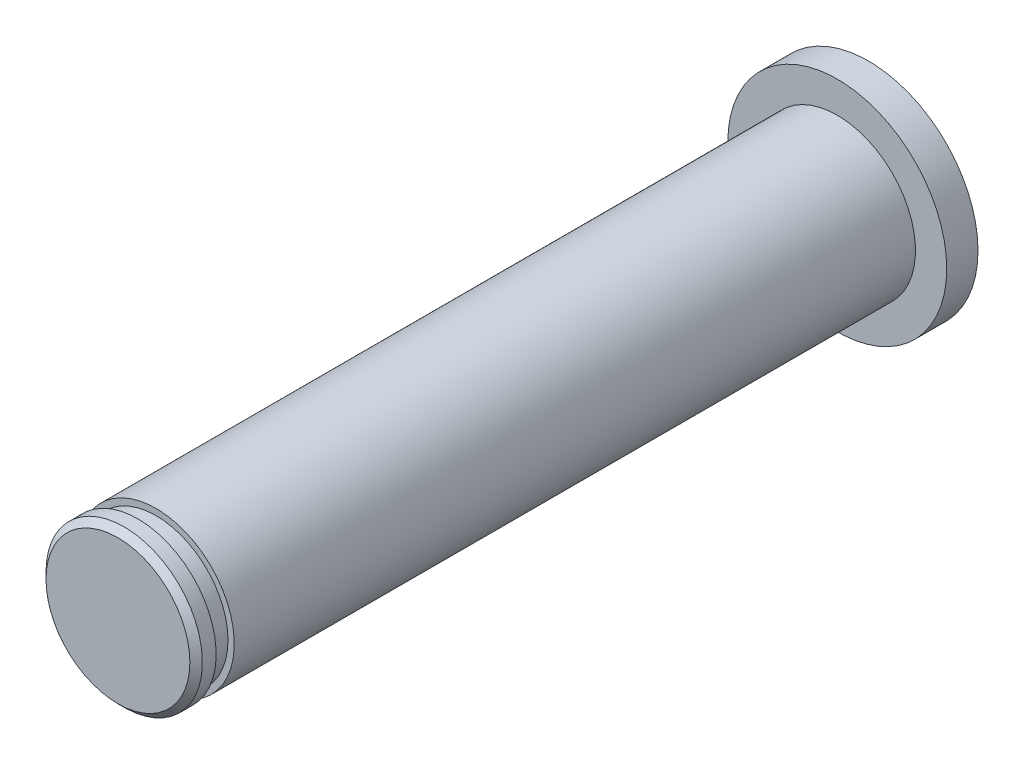
ISO-10303-21;
HEADER;
FILE_DESCRIPTION(('STEP AP214'),'2;1');
FILE_NAME('part.step','',(''),(''),'','','');
FILE_SCHEMA(('AUTOMOTIVE_DESIGN { 1 0 10303 214 1 1 1 1 }'));
ENDSEC;
DATA;
#1=APPLICATION_CONTEXT('core data for automotive mechanical design processes');
#2=APPLICATION_PROTOCOL_DEFINITION('international standard','automotive_design',2000,#1);
#3=PRODUCT_CONTEXT('',#1,'mechanical');
#4=PRODUCT('Part','Part','',(#3));
#5=PRODUCT_RELATED_PRODUCT_CATEGORY('part','',(#4));
#6=PRODUCT_DEFINITION_FORMATION('','',#4);
#7=PRODUCT_DEFINITION_CONTEXT('part definition',#1,'design');
#8=PRODUCT_DEFINITION('design','',#6,#7);
#9=PRODUCT_DEFINITION_SHAPE('','',#8);
#10=(LENGTH_UNIT() NAMED_UNIT(*) SI_UNIT(.MILLI.,.METRE.));
#11=(NAMED_UNIT(*) PLANE_ANGLE_UNIT() SI_UNIT($,.RADIAN.));
#12=(NAMED_UNIT(*) SI_UNIT($,.STERADIAN.) SOLID_ANGLE_UNIT());
#13=UNCERTAINTY_MEASURE_WITH_UNIT(LENGTH_MEASURE(1.E-05),#10,'distance_accuracy_value','');
#14=(GEOMETRIC_REPRESENTATION_CONTEXT(3) GLOBAL_UNCERTAINTY_ASSIGNED_CONTEXT((#13)) GLOBAL_UNIT_ASSIGNED_CONTEXT((#10,
#11,#12)) REPRESENTATION_CONTEXT('',''));
#15=CARTESIAN_POINT('',(0.,0.,0.));
#16=DIRECTION('',(0.,0.,1.));
#17=DIRECTION('',(1.,0.,0.));
#18=AXIS2_PLACEMENT_3D('',#15,#16,#17);
#19=CARTESIAN_POINT('',(0.,0.,30.48));
#20=DIRECTION('',(0.,0.,-1.));
#21=DIRECTION('',(-1.,0.,0.));
#22=AXIS2_PLACEMENT_3D('',#19,#20,#21);
#23=CYLINDRICAL_SURFACE('',#22,3.175);
#24=CARTESIAN_POINT('',(0.,0.,1.27));
#25=DIRECTION('',(0.,0.,1.));
#26=DIRECTION('',(1.,0.,0.));
#27=AXIS2_PLACEMENT_3D('',#24,#25,#26);
#28=CIRCLE('',#27,3.175);
#29=CARTESIAN_POINT('',(-3.175,0.,1.27));
#30=VERTEX_POINT('',#29);
#31=EDGE_CURVE('E45',#30,#30,#28,.T.);
#32=CARTESIAN_POINT('',(0.,0.,28.9306));
#33=DIRECTION('',(0.,0.,1.));
#34=DIRECTION('',(1.,0.,0.));
#35=AXIS2_PLACEMENT_3D('',#32,#33,#34);
#36=CIRCLE('',#35,3.175);
#37=CARTESIAN_POINT('',(-3.175,0.,28.9306));
#38=VERTEX_POINT('',#37);
#39=EDGE_CURVE('E55',#38,#38,#36,.T.);
#40=CARTESIAN_POINT('',(-3.175,0.,1.27));
#41=CARTESIAN_POINT('',(-3.175,0.,1.55813125));
#42=CARTESIAN_POINT('',(-3.175,0.,1.8462625));
#43=CARTESIAN_POINT('',(-3.175,0.,2.422525));
#44=CARTESIAN_POINT('',(-3.175,0.,2.71065625));
#45=CARTESIAN_POINT('',(-3.175,0.,3.28691875));
#46=CARTESIAN_POINT('',(-3.175,0.,3.57505));
#47=CARTESIAN_POINT('',(-3.175,0.,4.1513125));
#48=CARTESIAN_POINT('',(-3.175,0.,4.43944375));
#49=CARTESIAN_POINT('',(-3.175,0.,5.01570625));
#50=CARTESIAN_POINT('',(-3.175,0.,5.3038375));
#51=CARTESIAN_POINT('',(-3.175,0.,5.8801));
#52=CARTESIAN_POINT('',(-3.175,0.,6.16823125));
#53=CARTESIAN_POINT('',(-3.175,0.,6.74449375));
#54=CARTESIAN_POINT('',(-3.175,0.,7.032625));
#55=CARTESIAN_POINT('',(-3.175,0.,7.6088875));
#56=CARTESIAN_POINT('',(-3.175,0.,7.89701875));
#57=CARTESIAN_POINT('',(-3.175,0.,8.47328125));
#58=CARTESIAN_POINT('',(-3.175,0.,8.7614125));
#59=CARTESIAN_POINT('',(-3.175,0.,9.337675));
#60=CARTESIAN_POINT('',(-3.175,0.,9.62580625));
#61=CARTESIAN_POINT('',(-3.175,0.,10.20206875));
#62=CARTESIAN_POINT('',(-3.175,0.,10.4902));
#63=CARTESIAN_POINT('',(-3.175,0.,11.0664625));
#64=CARTESIAN_POINT('',(-3.175,0.,11.35459375));
#65=CARTESIAN_POINT('',(-3.175,0.,11.93085625));
#66=CARTESIAN_POINT('',(-3.175,0.,12.2189875));
#67=CARTESIAN_POINT('',(-3.175,0.,12.79525));
#68=CARTESIAN_POINT('',(-3.175,0.,13.08338125));
#69=CARTESIAN_POINT('',(-3.175,0.,13.65964375));
#70=CARTESIAN_POINT('',(-3.175,0.,13.947775));
#71=CARTESIAN_POINT('',(-3.175,0.,14.5240375));
#72=CARTESIAN_POINT('',(-3.175,0.,14.81216875));
#73=CARTESIAN_POINT('',(-3.175,0.,15.38843125));
#74=CARTESIAN_POINT('',(-3.175,0.,15.6765625));
#75=CARTESIAN_POINT('',(-3.175,0.,16.252825));
#76=CARTESIAN_POINT('',(-3.175,0.,16.54095625));
#77=CARTESIAN_POINT('',(-3.175,0.,17.11721875));
#78=CARTESIAN_POINT('',(-3.175,0.,17.40535));
#79=CARTESIAN_POINT('',(-3.175,0.,17.9816125));
#80=CARTESIAN_POINT('',(-3.175,0.,18.26974375));
#81=CARTESIAN_POINT('',(-3.175,0.,18.84600625));
#82=CARTESIAN_POINT('',(-3.175,0.,19.1341375));
#83=CARTESIAN_POINT('',(-3.175,0.,19.7104));
#84=CARTESIAN_POINT('',(-3.175,0.,19.99853125));
#85=CARTESIAN_POINT('',(-3.175,0.,20.57479375));
#86=CARTESIAN_POINT('',(-3.175,0.,20.862925));
#87=CARTESIAN_POINT('',(-3.175,0.,21.4391875));
#88=CARTESIAN_POINT('',(-3.175,0.,21.72731875));
#89=CARTESIAN_POINT('',(-3.175,0.,22.30358125));
#90=CARTESIAN_POINT('',(-3.175,0.,22.5917125));
#91=CARTESIAN_POINT('',(-3.175,0.,23.167975));
#92=CARTESIAN_POINT('',(-3.175,0.,23.45610625));
#93=CARTESIAN_POINT('',(-3.175,0.,24.03236875));
#94=CARTESIAN_POINT('',(-3.175,0.,24.3205));
#95=CARTESIAN_POINT('',(-3.175,0.,24.8967625));
#96=CARTESIAN_POINT('',(-3.175,0.,25.18489375));
#97=CARTESIAN_POINT('',(-3.175,0.,25.76115625));
#98=CARTESIAN_POINT('',(-3.175,0.,26.0492875));
#99=CARTESIAN_POINT('',(-3.175,0.,26.62555));
#100=CARTESIAN_POINT('',(-3.175,0.,26.91368125));
#101=CARTESIAN_POINT('',(-3.175,0.,27.48994375));
#102=CARTESIAN_POINT('',(-3.175,0.,27.778075));
#103=CARTESIAN_POINT('',(-3.175,0.,28.3543375));
#104=CARTESIAN_POINT('',(-3.175,0.,28.64246875));
#105=CARTESIAN_POINT('',(-3.175,0.,28.9306));
#106=B_SPLINE_CURVE_WITH_KNOTS('',3,(#40,#41,#42,#43,#44,#45,#46,#47,#48,#49,#50,#51,#52,#53,
#54,#55,#56,#57,#58,#59,#60,#61,#62,#63,#64,#65,#66,#67,#68,#69,#70,#71,#72,#73,#74,#75,#76,#77,
#78,#79,#80,#81,#82,#83,#84,#85,#86,#87,#88,#89,#90,#91,#92,#93,#94,#95,#96,#97,#98,#99,#100,
#101,#102,#103,#104,#105),.UNSPECIFIED.,.F.,.F.,(4,2,2,2,2,2,2,2,2,2,2,2,2,2,2,2,2,2,2,2,2,2,2,
2,2,2,2,2,2,2,2,2,4),(0.,0.864393750000001,1.7287875,2.59318125,3.457575,4.32196875,5.1863625,
6.05075625,6.91515,7.77954375,8.6439375,9.50833125,10.372725,11.23711875,12.1015125,12.96590625,
13.8303,14.69469375,15.5590875,16.42348125,17.287875,18.15226875,19.0166625,19.88105625,
20.74545,21.60984375,22.4742375,23.33863125,24.203025,25.06741875,25.9318125,26.79620625,
27.6606),.UNSPECIFIED.);
#107=EDGE_CURVE('BSEAM33',#30,#38,#106,.T.);
#108=ORIENTED_EDGE('',*,*,#31,.T.);
#109=ORIENTED_EDGE('',*,*,#39,.F.);
#110=ORIENTED_EDGE('',*,*,#107,.T.);
#111=ORIENTED_EDGE('',*,*,#107,.F.);
#112=EDGE_LOOP('',(#108,#110,#109,#111));
#113=FACE_BOUND('',#112,.T.);
#114=ADVANCED_FACE('F33',(#113),#23,.T.);
#115=CARTESIAN_POINT('',(0.,0.,1.27));
#116=DIRECTION('',(0.,0.,-1.));
#117=DIRECTION('',(-1.,0.,0.));
#118=AXIS2_PLACEMENT_3D('',#115,#116,#117);
#119=CYLINDRICAL_SURFACE('',#118,4.445);
#120=CARTESIAN_POINT('',(0.,0.,1.27));
#121=DIRECTION('',(0.,0.,1.));
#122=DIRECTION('',(1.,0.,0.));
#123=AXIS2_PLACEMENT_3D('',#120,#121,#122);
#124=CIRCLE('',#123,4.445);
#125=CARTESIAN_POINT('',(4.445,0.,1.27));
#126=VERTEX_POINT('',#125);
#127=EDGE_CURVE('E49',#126,#126,#124,.T.);
#128=ORIENTED_EDGE('',*,*,#127,.F.);
#129=EDGE_LOOP('',(#128));
#130=FACE_BOUND('',#129,.T.);
#131=CARTESIAN_POINT('',(0.,0.,0.));
#132=DIRECTION('',(0.,0.,1.));
#133=DIRECTION('',(1.,0.,0.));
#134=AXIS2_PLACEMENT_3D('',#131,#132,#133);
#135=CIRCLE('',#134,4.445);
#136=CARTESIAN_POINT('',(4.445,0.,0.));
#137=VERTEX_POINT('',#136);
#138=EDGE_CURVE('E52',#137,#137,#135,.T.);
#139=ORIENTED_EDGE('',*,*,#138,.T.);
#140=EDGE_LOOP('',(#139));
#141=FACE_BOUND('',#140,.T.);
#142=ADVANCED_FACE('F82',(#130,#141),#119,.T.);
#143=CARTESIAN_POINT('',(0.,0.,1.27));
#144=DIRECTION('',(0.,0.,1.));
#145=DIRECTION('',(1.,0.,0.));
#146=AXIS2_PLACEMENT_3D('',#143,#144,#145);
#147=PLANE('',#146);
#148=ORIENTED_EDGE('',*,*,#31,.F.);
#149=EDGE_LOOP('',(#148));
#150=FACE_BOUND('',#149,.T.);
#151=ORIENTED_EDGE('',*,*,#127,.T.);
#152=EDGE_LOOP('',(#151));
#153=FACE_BOUND('',#152,.T.);
#154=ADVANCED_FACE('F89',(#150,#153),#147,.T.);
#155=CARTESIAN_POINT('',(0.,0.,0.));
#156=DIRECTION('',(0.,0.,1.));
#157=DIRECTION('',(1.,0.,0.));
#158=AXIS2_PLACEMENT_3D('',#155,#156,#157);
#159=PLANE('',#158);
#160=ORIENTED_EDGE('',*,*,#138,.F.);
#161=EDGE_LOOP('',(#160));
#162=FACE_BOUND('',#161,.T.);
#163=ADVANCED_FACE('F77',(#162),#159,.F.);
#164=CARTESIAN_POINT('',(0.,0.,28.9306));
#165=DIRECTION('',(0.,0.,1.));
#166=DIRECTION('',(1.,0.,0.));
#167=AXIS2_PLACEMENT_3D('',#164,#165,#166);
#168=PLANE('',#167);
#169=CARTESIAN_POINT('',(0.,0.,28.9306));
#170=DIRECTION('',(0.,0.,1.));
#171=DIRECTION('',(1.,0.,0.));
#172=AXIS2_PLACEMENT_3D('',#169,#170,#171);
#173=CIRCLE('',#172,2.921);
#174=CARTESIAN_POINT('',(2.921,0.,28.9306));
#175=VERTEX_POINT('',#174);
#176=EDGE_CURVE('E61',#175,#175,#173,.T.);
#177=ORIENTED_EDGE('',*,*,#176,.F.);
#178=EDGE_LOOP('',(#177));
#179=FACE_BOUND('',#178,.T.);
#180=ORIENTED_EDGE('',*,*,#39,.T.);
#181=EDGE_LOOP('',(#180));
#182=FACE_BOUND('',#181,.T.);
#183=ADVANCED_FACE('F73',(#179,#182),#168,.T.);
#184=CARTESIAN_POINT('',(0.,0.,29.6672));
#185=DIRECTION('',(0.,0.,1.));
#186=DIRECTION('',(1.,0.,0.));
#187=AXIS2_PLACEMENT_3D('',#184,#185,#186);
#188=PLANE('',#187);
#189=CARTESIAN_POINT('',(0.,0.,29.6672));
#190=DIRECTION('',(0.,0.,1.));
#191=DIRECTION('',(1.,0.,0.));
#192=AXIS2_PLACEMENT_3D('',#189,#190,#191);
#193=CIRCLE('',#192,2.921);
#194=CARTESIAN_POINT('',(2.921,0.,29.6672));
#195=VERTEX_POINT('',#194);
#196=EDGE_CURVE('E64',#195,#195,#193,.T.);
#197=ORIENTED_EDGE('',*,*,#196,.T.);
#198=EDGE_LOOP('',(#197));
#199=FACE_BOUND('',#198,.T.);
#200=CARTESIAN_POINT('',(0.,0.,29.6672));
#201=DIRECTION('',(0.,0.,1.));
#202=DIRECTION('',(1.,0.,0.));
#203=AXIS2_PLACEMENT_3D('',#200,#201,#202);
#204=CIRCLE('',#203,3.175);
#205=CARTESIAN_POINT('',(-3.175,0.,29.6672));
#206=VERTEX_POINT('',#205);
#207=EDGE_CURVE('E58',#206,#206,#204,.T.);
#208=ORIENTED_EDGE('',*,*,#207,.F.);
#209=EDGE_LOOP('',(#208));
#210=FACE_BOUND('',#209,.T.);
#211=ADVANCED_FACE('F76',(#199,#210),#188,.F.);
#212=CARTESIAN_POINT('',(0.,0.,28.9306));
#213=DIRECTION('',(0.,0.,1.));
#214=DIRECTION('',(1.,0.,0.));
#215=AXIS2_PLACEMENT_3D('',#212,#213,#214);
#216=CYLINDRICAL_SURFACE('',#215,2.921);
#217=ORIENTED_EDGE('',*,*,#176,.T.);
#218=EDGE_LOOP('',(#217));
#219=FACE_BOUND('',#218,.T.);
#220=ORIENTED_EDGE('',*,*,#196,.F.);
#221=EDGE_LOOP('',(#220));
#222=FACE_BOUND('',#221,.T.);
#223=ADVANCED_FACE('F70',(#219,#222),#216,.T.);
#224=CARTESIAN_POINT('',(0.,0.,30.48));
#225=DIRECTION('',(0.,0.,1.));
#226=DIRECTION('',(1.,0.,0.));
#227=AXIS2_PLACEMENT_3D('',#224,#225,#226);
#228=PLANE('',#227);
#229=CARTESIAN_POINT('',(0.,0.,30.48));
#230=DIRECTION('',(0.,0.,1.));
#231=DIRECTION('',(1.,0.,0.));
#232=AXIS2_PLACEMENT_3D('',#229,#230,#231);
#233=CIRCLE('',#232,2.92100000000001);
#234=CARTESIAN_POINT('',(2.92100000000001,0.,30.48));
#235=VERTEX_POINT('',#234);
#236=EDGE_CURVE('E41',#235,#235,#233,.T.);
#237=ORIENTED_EDGE('',*,*,#236,.T.);
#238=EDGE_LOOP('',(#237));
#239=FACE_BOUND('',#238,.T.);
#240=ADVANCED_FACE('F94',(#239),#228,.T.);
#241=CARTESIAN_POINT('',(0.,0.,30.226));
#242=DIRECTION('',(0.,0.,1.));
#243=DIRECTION('',(1.,0.,0.));
#244=AXIS2_PLACEMENT_3D('',#241,#242,#243);
#245=CIRCLE('',#244,3.175);
#246=CARTESIAN_POINT('',(-3.175,0.,30.226));
#247=VERTEX_POINT('',#246);
#248=EDGE_CURVE('E10',#247,#247,#245,.F.);
#249=CARTESIAN_POINT('',(-3.175,0.,30.226));
#250=CARTESIAN_POINT('',(-3.175,0.,30.2201791666667));
#251=CARTESIAN_POINT('',(-3.175,0.,30.2143583333333));
#252=CARTESIAN_POINT('',(-3.175,0.,30.2027166666667));
#253=CARTESIAN_POINT('',(-3.175,0.,30.1968958333333));
#254=CARTESIAN_POINT('',(-3.175,0.,30.1852541666667));
#255=CARTESIAN_POINT('',(-3.175,0.,30.1794333333333));
#256=CARTESIAN_POINT('',(-3.175,0.,30.1677916666667));
#257=CARTESIAN_POINT('',(-3.175,0.,30.1619708333333));
#258=CARTESIAN_POINT('',(-3.175,0.,30.1503291666667));
#259=CARTESIAN_POINT('',(-3.175,0.,30.1445083333333));
#260=CARTESIAN_POINT('',(-3.175,0.,30.1328666666667));
#261=CARTESIAN_POINT('',(-3.175,0.,30.1270458333333));
#262=CARTESIAN_POINT('',(-3.175,0.,30.1154041666667));
#263=CARTESIAN_POINT('',(-3.175,0.,30.1095833333333));
#264=CARTESIAN_POINT('',(-3.175,0.,30.0979416666667));
#265=CARTESIAN_POINT('',(-3.175,0.,30.0921208333333));
#266=CARTESIAN_POINT('',(-3.175,0.,30.0804791666667));
#267=CARTESIAN_POINT('',(-3.175,0.,30.0746583333333));
#268=CARTESIAN_POINT('',(-3.175,0.,30.0630166666667));
#269=CARTESIAN_POINT('',(-3.175,0.,30.0571958333333));
#270=CARTESIAN_POINT('',(-3.175,0.,30.0455541666667));
#271=CARTESIAN_POINT('',(-3.175,0.,30.0397333333333));
#272=CARTESIAN_POINT('',(-3.175,0.,30.0280916666667));
#273=CARTESIAN_POINT('',(-3.175,0.,30.0222708333333));
#274=CARTESIAN_POINT('',(-3.175,0.,30.0106291666667));
#275=CARTESIAN_POINT('',(-3.175,0.,30.0048083333333));
#276=CARTESIAN_POINT('',(-3.175,0.,29.9931666666667));
#277=CARTESIAN_POINT('',(-3.175,0.,29.9873458333333));
#278=CARTESIAN_POINT('',(-3.175,0.,29.9757041666667));
#279=CARTESIAN_POINT('',(-3.175,0.,29.9698833333333));
#280=CARTESIAN_POINT('',(-3.175,0.,29.9582416666667));
#281=CARTESIAN_POINT('',(-3.175,0.,29.9524208333333));
#282=CARTESIAN_POINT('',(-3.175,0.,29.9407791666667));
#283=CARTESIAN_POINT('',(-3.175,0.,29.9349583333333));
#284=CARTESIAN_POINT('',(-3.175,0.,29.9233166666667));
#285=CARTESIAN_POINT('',(-3.175,0.,29.9174958333333));
#286=CARTESIAN_POINT('',(-3.175,0.,29.9058541666667));
#287=CARTESIAN_POINT('',(-3.175,0.,29.9000333333333));
#288=CARTESIAN_POINT('',(-3.175,0.,29.8883916666667));
#289=CARTESIAN_POINT('',(-3.175,0.,29.8825708333333));
#290=CARTESIAN_POINT('',(-3.175,0.,29.8709291666667));
#291=CARTESIAN_POINT('',(-3.175,0.,29.8651083333333));
#292=CARTESIAN_POINT('',(-3.175,0.,29.8534666666667));
#293=CARTESIAN_POINT('',(-3.175,0.,29.8476458333333));
#294=CARTESIAN_POINT('',(-3.175,0.,29.8360041666667));
#295=CARTESIAN_POINT('',(-3.175,0.,29.8301833333333));
#296=CARTESIAN_POINT('',(-3.175,0.,29.8185416666667));
#297=CARTESIAN_POINT('',(-3.175,0.,29.8127208333333));
#298=CARTESIAN_POINT('',(-3.175,0.,29.8010791666667));
#299=CARTESIAN_POINT('',(-3.175,0.,29.7952583333333));
#300=CARTESIAN_POINT('',(-3.175,0.,29.7836166666667));
#301=CARTESIAN_POINT('',(-3.175,0.,29.7777958333333));
#302=CARTESIAN_POINT('',(-3.175,0.,29.7661541666667));
#303=CARTESIAN_POINT('',(-3.175,0.,29.7603333333333));
#304=CARTESIAN_POINT('',(-3.175,0.,29.7486916666667));
#305=CARTESIAN_POINT('',(-3.175,0.,29.7428708333333));
#306=CARTESIAN_POINT('',(-3.175,0.,29.7312291666667));
#307=CARTESIAN_POINT('',(-3.175,0.,29.7254083333333));
#308=CARTESIAN_POINT('',(-3.175,0.,29.7137666666667));
#309=CARTESIAN_POINT('',(-3.175,0.,29.7079458333333));
#310=CARTESIAN_POINT('',(-3.175,0.,29.6963041666667));
#311=CARTESIAN_POINT('',(-3.175,0.,29.6904833333333));
#312=CARTESIAN_POINT('',(-3.175,0.,29.6788416666667));
#313=CARTESIAN_POINT('',(-3.175,0.,29.6730208333333));
#314=CARTESIAN_POINT('',(-3.175,0.,29.6672));
#315=B_SPLINE_CURVE_WITH_KNOTS('',3,(#249,#250,#251,#252,#253,#254,#255,#256,#257,#258,#259,
#260,#261,#262,#263,#264,#265,#266,#267,#268,#269,#270,#271,#272,#273,#274,#275,#276,#277,#278,
#279,#280,#281,#282,#283,#284,#285,#286,#287,#288,#289,#290,#291,#292,#293,#294,#295,#296,#297,
#298,#299,#300,#301,#302,#303,#304,#305,#306,#307,#308,#309,#310,#311,#312,#313,#314),
.UNSPECIFIED.,.F.,.F.,(4,2,2,2,2,2,2,2,2,2,2,2,2,2,2,2,2,2,2,2,2,2,2,2,2,2,2,2,2,2,2,2,4),(0.,
0.0174624999999991,0.0349249999999982,0.0523874999999972,0.0698499999999998,0.0873124999999988,
0.104774999999998,0.1222375,0.1397,0.157162499999999,0.174625000000001,0.1920875,
0.209549999999999,0.227012500000002,0.244475000000001,0.2619375,0.279400000000003,
0.296862500000002,0.314325000000001,0.3317875,0.349250000000002,0.366712500000001,0.384175,
0.401637500000003,0.419100000000002,0.436562500000001,0.454025000000004,0.471487500000003,
0.488950000000002,0.506412500000004,0.523875000000004,0.541337500000003,0.558800000000005),.UNSPECIFIED.);
#316=EDGE_CURVE('BSEAM85',#247,#206,#315,.T.);
#317=ORIENTED_EDGE('',*,*,#248,.T.);
#318=ORIENTED_EDGE('',*,*,#207,.T.);
#319=ORIENTED_EDGE('',*,*,#316,.T.);
#320=ORIENTED_EDGE('',*,*,#316,.F.);
#321=EDGE_LOOP('',(#317,#319,#318,#320));
#322=FACE_BOUND('',#321,.T.);
#323=ADVANCED_FACE('F85',(#322),#23,.T.);
#324=CARTESIAN_POINT('',(0.,0.,30.48));
#325=DIRECTION('',(0.,0.,-1.));
#326=DIRECTION('',(-1.,0.,0.));
#327=AXIS2_PLACEMENT_3D('',#324,#325,#326);
#328=CONICAL_SURFACE('',#327,2.92100000000001,0.785398163397441);
#329=ORIENTED_EDGE('',*,*,#248,.F.);
#330=EDGE_LOOP('',(#329));
#331=FACE_BOUND('',#330,.T.);
#332=ORIENTED_EDGE('',*,*,#236,.F.);
#333=EDGE_LOOP('',(#332));
#334=FACE_BOUND('',#333,.T.);
#335=ADVANCED_FACE('F36',(#331,#334),#328,.T.);
#336=CLOSED_SHELL('',(#114,#142,#154,#163,#183,#211,#223,#240,#323,#335));
#337=MANIFOLD_SOLID_BREP('B2',#336);
#338=ADVANCED_BREP_SHAPE_REPRESENTATION('',(#18,#337),#14);
#339=SHAPE_DEFINITION_REPRESENTATION(#9,#338);
ENDSEC;
END-ISO-10303-21;
